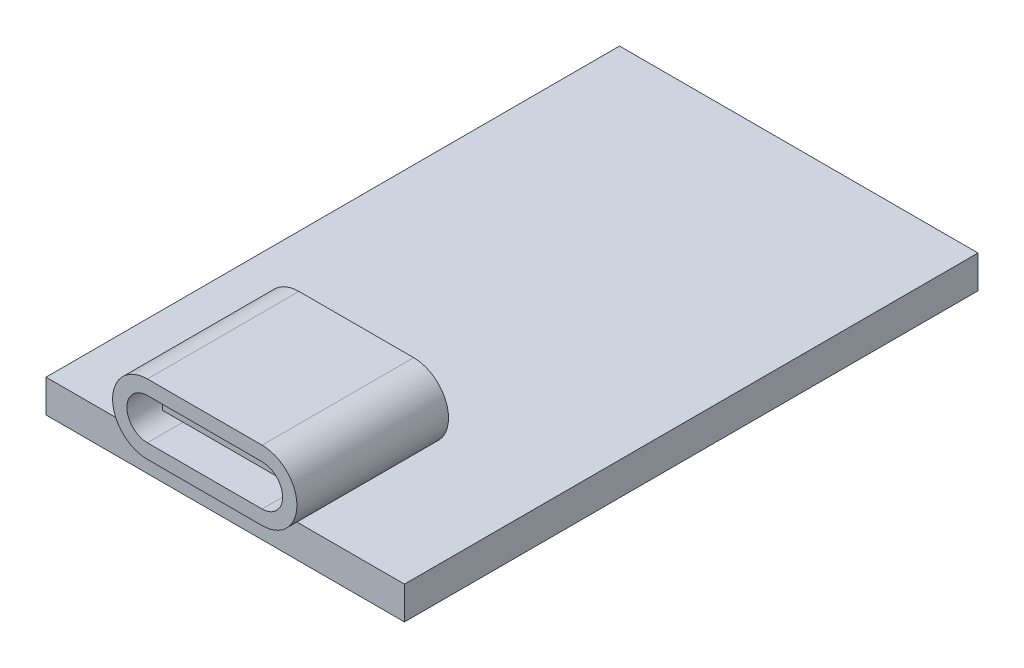
ISO-10303-21;
HEADER;
FILE_DESCRIPTION(('STEP AP214'),'2;1');
FILE_NAME('part.step','',(''),(''),'','','');
FILE_SCHEMA(('AUTOMOTIVE_DESIGN { 1 0 10303 214 1 1 1 1 }'));
ENDSEC;
DATA;
#1=APPLICATION_CONTEXT('core data for automotive mechanical design processes');
#2=APPLICATION_PROTOCOL_DEFINITION('international standard','automotive_design',2000,#1);
#3=PRODUCT_CONTEXT('',#1,'mechanical');
#4=PRODUCT('Part','Part','',(#3));
#5=PRODUCT_RELATED_PRODUCT_CATEGORY('part','',(#4));
#6=PRODUCT_DEFINITION_FORMATION('','',#4);
#7=PRODUCT_DEFINITION_CONTEXT('part definition',#1,'design');
#8=PRODUCT_DEFINITION('design','',#6,#7);
#9=PRODUCT_DEFINITION_SHAPE('','',#8);
#10=(LENGTH_UNIT() NAMED_UNIT(*) SI_UNIT(.MILLI.,.METRE.));
#11=(NAMED_UNIT(*) PLANE_ANGLE_UNIT() SI_UNIT($,.RADIAN.));
#12=(NAMED_UNIT(*) SI_UNIT($,.STERADIAN.) SOLID_ANGLE_UNIT());
#13=UNCERTAINTY_MEASURE_WITH_UNIT(LENGTH_MEASURE(1.E-05),#10,'distance_accuracy_value','');
#14=(GEOMETRIC_REPRESENTATION_CONTEXT(3) GLOBAL_UNCERTAINTY_ASSIGNED_CONTEXT((#13)) GLOBAL_UNIT_ASSIGNED_CONTEXT((#10,
#11,#12)) REPRESENTATION_CONTEXT('',''));
#15=CARTESIAN_POINT('',(0.,0.,0.));
#16=DIRECTION('',(0.,0.,1.));
#17=DIRECTION('',(1.,0.,0.));
#18=AXIS2_PLACEMENT_3D('',#15,#16,#17);
#19=CARTESIAN_POINT('',(11.55,3.3,-5.));
#20=DIRECTION('',(0.,0.,1.));
#21=DIRECTION('',(1.,0.,0.));
#22=AXIS2_PLACEMENT_3D('',#19,#20,#21);
#23=PLANE('',#22);
#24=CARTESIAN_POINT('',(11.55,3.3,-5.));
#25=DIRECTION('',(0.,0.,1.));
#26=DIRECTION('',(1.,0.,0.));
#27=AXIS2_PLACEMENT_3D('',#24,#25,#26);
#28=CIRCLE('',#27,1.);
#29=CARTESIAN_POINT('',(11.55,2.3,-5.));
#30=VERTEX_POINT('',#29);
#31=CARTESIAN_POINT('',(11.55,4.3,-5.));
#32=VERTEX_POINT('',#31);
#33=EDGE_CURVE('E183',#30,#32,#28,.T.);
#34=ORIENTED_EDGE('',*,*,#33,.T.);
#35=DIRECTION('',(-1.,0.,0.));
#36=VECTOR('',#35,1.);
#37=CARTESIAN_POINT('',(11.55,4.3,-5.));
#38=LINE('',#37,#36);
#39=CARTESIAN_POINT('',(5.95,4.3,-5.));
#40=VERTEX_POINT('',#39);
#41=EDGE_CURVE('E186',#32,#40,#38,.T.);
#42=ORIENTED_EDGE('',*,*,#41,.T.);
#43=CARTESIAN_POINT('',(5.95,3.3,-5.));
#44=DIRECTION('',(0.,0.,1.));
#45=DIRECTION('',(1.,0.,0.));
#46=AXIS2_PLACEMENT_3D('',#43,#44,#45);
#47=CIRCLE('',#46,1.);
#48=CARTESIAN_POINT('',(5.95,2.3,-5.));
#49=VERTEX_POINT('',#48);
#50=EDGE_CURVE('E190',#40,#49,#47,.T.);
#51=ORIENTED_EDGE('',*,*,#50,.T.);
#52=DIRECTION('',(1.,0.,0.));
#53=VECTOR('',#52,1.);
#54=CARTESIAN_POINT('',(11.55,2.3,-5.));
#55=LINE('',#54,#53);
#56=EDGE_CURVE('E193',#49,#30,#55,.T.);
#57=ORIENTED_EDGE('',*,*,#56,.T.);
#58=EDGE_LOOP('',(#34,#42,#51,#57));
#59=FACE_BOUND('',#58,.T.);
#60=DIRECTION('',(1.,0.,0.));
#61=VECTOR('',#60,1.);
#62=CARTESIAN_POINT('',(5.69526407856018,3.0413895272943,-5.));
#63=LINE('',#62,#61);
#64=CARTESIAN_POINT('',(5.69526407856018,3.0413895272943,-5.));
#65=VERTEX_POINT('',#64);
#66=CARTESIAN_POINT('',(11.8052805830846,3.0413895272943,-5.));
#67=VERTEX_POINT('',#66);
#68=EDGE_CURVE('E511',#65,#67,#63,.T.);
#69=ORIENTED_EDGE('',*,*,#68,.F.);
#70=DIRECTION('',(0.,-1.,0.));
#71=VECTOR('',#70,1.);
#72=CARTESIAN_POINT('',(5.69526407856018,3.53019084765625,-5.));
#73=LINE('',#72,#71);
#74=CARTESIAN_POINT('',(5.69526407856018,3.53019084765625,-5.));
#75=VERTEX_POINT('',#74);
#76=EDGE_CURVE('E175',#75,#65,#73,.T.);
#77=ORIENTED_EDGE('',*,*,#76,.F.);
#78=DIRECTION('',(-1.,0.,0.));
#79=VECTOR('',#78,1.);
#80=CARTESIAN_POINT('',(5.69526407856018,3.53019084765625,-5.));
#81=LINE('',#80,#79);
#82=CARTESIAN_POINT('',(11.8052805830846,3.53019084765625,-5.));
#83=VERTEX_POINT('',#82);
#84=EDGE_CURVE('E171',#83,#75,#81,.T.);
#85=ORIENTED_EDGE('',*,*,#84,.F.);
#86=DIRECTION('',(0.,1.,0.));
#87=VECTOR('',#86,1.);
#88=CARTESIAN_POINT('',(11.8052805830846,3.53019084765625,-5.));
#89=LINE('',#88,#87);
#90=EDGE_CURVE('E508',#67,#83,#89,.T.);
#91=ORIENTED_EDGE('',*,*,#90,.F.);
#92=EDGE_LOOP('',(#69,#77,#85,#91));
#93=FACE_BOUND('',#92,.T.);
#94=ADVANCED_FACE('F33',(#59,#93),#23,.T.);
#95=CARTESIAN_POINT('',(0.,1.6,0.));
#96=DIRECTION('',(0.,-1.,0.));
#97=DIRECTION('',(0.,0.,-1.));
#98=AXIS2_PLACEMENT_3D('',#95,#96,#97);
#99=PLANE('',#98);
#100=DIRECTION('',(0.,0.,1.));
#101=VECTOR('',#100,1.);
#102=CARTESIAN_POINT('',(5.95,1.6,-6.4));
#103=LINE('',#102,#101);
#104=CARTESIAN_POINT('',(5.95,1.6,-6.4));
#105=VERTEX_POINT('',#104);
#106=CARTESIAN_POINT('',(5.95,1.6,0.));
#107=VERTEX_POINT('',#106);
#108=EDGE_CURVE('E243',#105,#107,#103,.T.);
#109=ORIENTED_EDGE('',*,*,#108,.F.);
#110=DIRECTION('',(1.,0.,0.));
#111=VECTOR('',#110,1.);
#112=CARTESIAN_POINT('',(5.95,1.6,-6.4));
#113=LINE('',#112,#111);
#114=CARTESIAN_POINT('',(11.55,1.6,-6.4));
#115=VERTEX_POINT('',#114);
#116=EDGE_CURVE('E226',#105,#115,#113,.T.);
#117=ORIENTED_EDGE('',*,*,#116,.T.);
#118=DIRECTION('',(0.,0.,1.));
#119=VECTOR('',#118,1.);
#120=CARTESIAN_POINT('',(11.55,1.6,-6.4));
#121=LINE('',#120,#119);
#122=CARTESIAN_POINT('',(11.55,1.6,0.));
#123=VERTEX_POINT('',#122);
#124=EDGE_CURVE('E240',#115,#123,#121,.T.);
#125=ORIENTED_EDGE('',*,*,#124,.T.);
#126=DIRECTION('',(1.,0.,0.));
#127=VECTOR('',#126,1.);
#128=CARTESIAN_POINT('',(0.,1.6,0.));
#129=LINE('',#128,#127);
#130=CARTESIAN_POINT('',(17.5,1.6,0.));
#131=VERTEX_POINT('',#130);
#132=EDGE_CURVE('E249',#123,#131,#129,.T.);
#133=ORIENTED_EDGE('',*,*,#132,.T.);
#134=DIRECTION('',(0.,0.,-1.));
#135=VECTOR('',#134,1.);
#136=CARTESIAN_POINT('',(17.5,1.6,0.));
#137=LINE('',#136,#135);
#138=CARTESIAN_POINT('',(17.5,1.6,-28.));
#139=VERTEX_POINT('',#138);
#140=EDGE_CURVE('E254',#131,#139,#137,.T.);
#141=ORIENTED_EDGE('',*,*,#140,.T.);
#142=DIRECTION('',(-1.,0.,0.));
#143=VECTOR('',#142,1.);
#144=CARTESIAN_POINT('',(0.,1.6,-28.));
#145=LINE('',#144,#143);
#146=CARTESIAN_POINT('',(0.,1.6,-28.));
#147=VERTEX_POINT('',#146);
#148=EDGE_CURVE('E257',#139,#147,#145,.T.);
#149=ORIENTED_EDGE('',*,*,#148,.T.);
#150=DIRECTION('',(0.,0.,1.));
#151=VECTOR('',#150,1.);
#152=CARTESIAN_POINT('',(0.,1.6,0.));
#153=LINE('',#152,#151);
#154=CARTESIAN_POINT('',(0.,1.6,0.));
#155=VERTEX_POINT('',#154);
#156=EDGE_CURVE('E246',#147,#155,#153,.T.);
#157=ORIENTED_EDGE('',*,*,#156,.T.);
#158=EDGE_CURVE('E251',#155,#107,#129,.T.);
#159=ORIENTED_EDGE('',*,*,#158,.T.);
#160=EDGE_LOOP('',(#109,#117,#125,#133,#141,#149,#157,#159));
#161=FACE_BOUND('',#160,.T.);
#162=ADVANCED_FACE('F292',(#161),#99,.F.);
#163=CARTESIAN_POINT('',(0.,1.6,0.));
#164=DIRECTION('',(1.,0.,0.));
#165=DIRECTION('',(0.,0.,-1.));
#166=AXIS2_PLACEMENT_3D('',#163,#164,#165);
#167=PLANE('',#166);
#168=DIRECTION('',(0.,0.,1.));
#169=VECTOR('',#168,1.);
#170=CARTESIAN_POINT('',(0.,0.,0.));
#171=LINE('',#170,#169);
#172=CARTESIAN_POINT('',(0.,0.,-28.));
#173=VERTEX_POINT('',#172);
#174=CARTESIAN_POINT('',(0.,0.,0.));
#175=VERTEX_POINT('',#174);
#176=EDGE_CURVE('E237',#173,#175,#171,.T.);
#177=ORIENTED_EDGE('',*,*,#176,.T.);
#178=DIRECTION('',(0.,-1.,0.));
#179=VECTOR('',#178,1.);
#180=CARTESIAN_POINT('',(0.,1.6,0.));
#181=LINE('',#180,#179);
#182=EDGE_CURVE('E11',#155,#175,#181,.T.);
#183=ORIENTED_EDGE('',*,*,#182,.F.);
#184=ORIENTED_EDGE('',*,*,#156,.F.);
#185=DIRECTION('',(0.,-1.,0.));
#186=VECTOR('',#185,1.);
#187=CARTESIAN_POINT('',(0.,1.6,-28.));
#188=LINE('',#187,#186);
#189=EDGE_CURVE('E259',#147,#173,#188,.T.);
#190=ORIENTED_EDGE('',*,*,#189,.T.);
#191=EDGE_LOOP('',(#177,#183,#184,#190));
#192=FACE_BOUND('',#191,.T.);
#193=ADVANCED_FACE('F35',(#192),#167,.F.);
#194=CARTESIAN_POINT('',(0.,1.6,0.));
#195=DIRECTION('',(0.,0.,-1.));
#196=DIRECTION('',(-1.,0.,0.));
#197=AXIS2_PLACEMENT_3D('',#194,#195,#196);
#198=PLANE('',#197);
#199=DIRECTION('',(1.,0.,0.));
#200=VECTOR('',#199,1.);
#201=CARTESIAN_POINT('',(0.,0.,0.));
#202=LINE('',#201,#200);
#203=CARTESIAN_POINT('',(17.5,0.,0.));
#204=VERTEX_POINT('',#203);
#205=EDGE_CURVE('E262',#175,#204,#202,.T.);
#206=ORIENTED_EDGE('',*,*,#205,.T.);
#207=DIRECTION('',(0.,-1.,0.));
#208=VECTOR('',#207,1.);
#209=CARTESIAN_POINT('',(17.5,1.6,0.));
#210=LINE('',#209,#208);
#211=EDGE_CURVE('E41',#131,#204,#210,.T.);
#212=ORIENTED_EDGE('',*,*,#211,.F.);
#213=ORIENTED_EDGE('',*,*,#132,.F.);
#214=EDGE_CURVE('E255',#107,#123,#129,.T.);
#215=ORIENTED_EDGE('',*,*,#214,.F.);
#216=ORIENTED_EDGE('',*,*,#158,.F.);
#217=ORIENTED_EDGE('',*,*,#182,.T.);
#218=EDGE_LOOP('',(#206,#212,#213,#215,#216,#217));
#219=FACE_BOUND('',#218,.T.);
#220=ADVANCED_FACE('F482',(#219),#198,.F.);
#221=CARTESIAN_POINT('',(17.5,1.6,0.));
#222=DIRECTION('',(-1.,0.,0.));
#223=DIRECTION('',(0.,0.,1.));
#224=AXIS2_PLACEMENT_3D('',#221,#222,#223);
#225=PLANE('',#224);
#226=DIRECTION('',(0.,0.,-1.));
#227=VECTOR('',#226,1.);
#228=CARTESIAN_POINT('',(17.5,0.,0.));
#229=LINE('',#228,#227);
#230=CARTESIAN_POINT('',(17.5,0.,-28.));
#231=VERTEX_POINT('',#230);
#232=EDGE_CURVE('E264',#204,#231,#229,.T.);
#233=ORIENTED_EDGE('',*,*,#232,.T.);
#234=DIRECTION('',(0.,-1.,0.));
#235=VECTOR('',#234,1.);
#236=CARTESIAN_POINT('',(17.5,1.6,-28.));
#237=LINE('',#236,#235);
#238=EDGE_CURVE('E269',#139,#231,#237,.T.);
#239=ORIENTED_EDGE('',*,*,#238,.F.);
#240=ORIENTED_EDGE('',*,*,#140,.F.);
#241=ORIENTED_EDGE('',*,*,#211,.T.);
#242=EDGE_LOOP('',(#233,#239,#240,#241));
#243=FACE_BOUND('',#242,.T.);
#244=ADVANCED_FACE('F276',(#243),#225,.F.);
#245=CARTESIAN_POINT('',(0.,1.6,-28.));
#246=DIRECTION('',(0.,0.,1.));
#247=DIRECTION('',(1.,0.,0.));
#248=AXIS2_PLACEMENT_3D('',#245,#246,#247);
#249=PLANE('',#248);
#250=DIRECTION('',(-1.,0.,0.));
#251=VECTOR('',#250,1.);
#252=CARTESIAN_POINT('',(0.,0.,-28.));
#253=LINE('',#252,#251);
#254=EDGE_CURVE('E250',#231,#173,#253,.T.);
#255=ORIENTED_EDGE('',*,*,#254,.T.);
#256=ORIENTED_EDGE('',*,*,#189,.F.);
#257=ORIENTED_EDGE('',*,*,#148,.F.);
#258=ORIENTED_EDGE('',*,*,#238,.T.);
#259=EDGE_LOOP('',(#255,#256,#257,#258));
#260=FACE_BOUND('',#259,.T.);
#261=ADVANCED_FACE('F286',(#260),#249,.F.);
#262=CARTESIAN_POINT('',(0.,0.,0.));
#263=DIRECTION('',(0.,-1.,0.));
#264=DIRECTION('',(0.,0.,-1.));
#265=AXIS2_PLACEMENT_3D('',#262,#263,#264);
#266=PLANE('',#265);
#267=ORIENTED_EDGE('',*,*,#176,.F.);
#268=ORIENTED_EDGE('',*,*,#254,.F.);
#269=ORIENTED_EDGE('',*,*,#232,.F.);
#270=ORIENTED_EDGE('',*,*,#205,.F.);
#271=EDGE_LOOP('',(#267,#268,#269,#270));
#272=FACE_BOUND('',#271,.T.);
#273=ADVANCED_FACE('F283',(#272),#266,.T.);
#274=CARTESIAN_POINT('',(5.95,1.6,-6.4));
#275=DIRECTION('',(0.,-1.,0.));
#276=DIRECTION('',(1.,0.,0.));
#277=AXIS2_PLACEMENT_3D('',#274,#275,#276);
#278=PLANE('',#277);
#279=ORIENTED_EDGE('',*,*,#214,.T.);
#280=CARTESIAN_POINT('',(11.55,1.6,1.));
#281=VERTEX_POINT('',#280);
#282=EDGE_CURVE('E242',#123,#281,#121,.T.);
#283=ORIENTED_EDGE('',*,*,#282,.T.);
#284=DIRECTION('',(1.,0.,0.));
#285=VECTOR('',#284,1.);
#286=CARTESIAN_POINT('',(5.95,1.6,1.));
#287=LINE('',#286,#285);
#288=CARTESIAN_POINT('',(5.95,1.6,1.));
#289=VERTEX_POINT('',#288);
#290=EDGE_CURVE('E214',#289,#281,#287,.T.);
#291=ORIENTED_EDGE('',*,*,#290,.F.);
#292=EDGE_CURVE('E234',#107,#289,#103,.T.);
#293=ORIENTED_EDGE('',*,*,#292,.F.);
#294=EDGE_LOOP('',(#279,#283,#291,#293));
#295=FACE_BOUND('',#294,.T.);
#296=ADVANCED_FACE('F298',(#295),#278,.T.);
#297=CARTESIAN_POINT('',(5.95,3.3,-6.4));
#298=DIRECTION('',(0.,0.,1.));
#299=DIRECTION('',(1.,0.,0.));
#300=AXIS2_PLACEMENT_3D('',#297,#298,#299);
#301=CYLINDRICAL_SURFACE('',#300,1.7);
#302=ORIENTED_EDGE('',*,*,#108,.T.);
#303=ORIENTED_EDGE('',*,*,#292,.T.);
#304=CARTESIAN_POINT('',(5.95,3.3,1.));
#305=DIRECTION('',(0.,0.,1.));
#306=DIRECTION('',(1.,0.,0.));
#307=AXIS2_PLACEMENT_3D('',#304,#305,#306);
#308=CIRCLE('',#307,1.7);
#309=CARTESIAN_POINT('',(5.95,5.,1.));
#310=VERTEX_POINT('',#309);
#311=EDGE_CURVE('E206',#310,#289,#308,.T.);
#312=ORIENTED_EDGE('',*,*,#311,.F.);
#313=DIRECTION('',(0.,0.,1.));
#314=VECTOR('',#313,1.);
#315=CARTESIAN_POINT('',(5.95,5.,-6.4));
#316=LINE('',#315,#314);
#317=CARTESIAN_POINT('',(5.95,5.,-6.4));
#318=VERTEX_POINT('',#317);
#319=EDGE_CURVE('E235',#318,#310,#316,.T.);
#320=ORIENTED_EDGE('',*,*,#319,.F.);
#321=CARTESIAN_POINT('',(5.95,3.3,-6.4));
#322=DIRECTION('',(0.,0.,1.));
#323=DIRECTION('',(1.,0.,0.));
#324=AXIS2_PLACEMENT_3D('',#321,#322,#323);
#325=CIRCLE('',#324,1.7);
#326=EDGE_CURVE('E223',#318,#105,#325,.T.);
#327=ORIENTED_EDGE('',*,*,#326,.T.);
#328=EDGE_LOOP('',(#302,#303,#312,#320,#327));
#329=FACE_BOUND('',#328,.T.);
#330=ADVANCED_FACE('F313',(#329),#301,.T.);
#331=CARTESIAN_POINT('',(5.95,5.,-6.4));
#332=DIRECTION('',(0.,1.,0.));
#333=DIRECTION('',(-1.,0.,0.));
#334=AXIS2_PLACEMENT_3D('',#331,#332,#333);
#335=PLANE('',#334);
#336=ORIENTED_EDGE('',*,*,#319,.T.);
#337=DIRECTION('',(-1.,0.,0.));
#338=VECTOR('',#337,1.);
#339=CARTESIAN_POINT('',(5.95,5.,1.));
#340=LINE('',#339,#338);
#341=CARTESIAN_POINT('',(11.55,5.,1.));
#342=VERTEX_POINT('',#341);
#343=EDGE_CURVE('E220',#342,#310,#340,.T.);
#344=ORIENTED_EDGE('',*,*,#343,.F.);
#345=DIRECTION('',(0.,0.,1.));
#346=VECTOR('',#345,1.);
#347=CARTESIAN_POINT('',(11.55,5.,-6.4));
#348=LINE('',#347,#346);
#349=CARTESIAN_POINT('',(11.55,5.,-6.4));
#350=VERTEX_POINT('',#349);
#351=EDGE_CURVE('E238',#350,#342,#348,.T.);
#352=ORIENTED_EDGE('',*,*,#351,.F.);
#353=DIRECTION('',(-1.,0.,0.));
#354=VECTOR('',#353,1.);
#355=CARTESIAN_POINT('',(5.95,5.,-6.4));
#356=LINE('',#355,#354);
#357=EDGE_CURVE('E231',#350,#318,#356,.T.);
#358=ORIENTED_EDGE('',*,*,#357,.T.);
#359=EDGE_LOOP('',(#336,#344,#352,#358));
#360=FACE_BOUND('',#359,.T.);
#361=ADVANCED_FACE('F309',(#360),#335,.T.);
#362=CARTESIAN_POINT('',(11.55,3.3,-6.4));
#363=DIRECTION('',(0.,0.,1.));
#364=DIRECTION('',(1.,0.,0.));
#365=AXIS2_PLACEMENT_3D('',#362,#363,#364);
#366=CYLINDRICAL_SURFACE('',#365,1.7);
#367=ORIENTED_EDGE('',*,*,#351,.T.);
#368=CARTESIAN_POINT('',(11.55,3.3,1.));
#369=DIRECTION('',(0.,0.,1.));
#370=DIRECTION('',(1.,0.,0.));
#371=AXIS2_PLACEMENT_3D('',#368,#369,#370);
#372=CIRCLE('',#371,1.7);
#373=EDGE_CURVE('E217',#281,#342,#372,.T.);
#374=ORIENTED_EDGE('',*,*,#373,.F.);
#375=ORIENTED_EDGE('',*,*,#282,.F.);
#376=ORIENTED_EDGE('',*,*,#124,.F.);
#377=CARTESIAN_POINT('',(11.55,3.3,-6.4));
#378=DIRECTION('',(0.,0.,1.));
#379=DIRECTION('',(1.,0.,0.));
#380=AXIS2_PLACEMENT_3D('',#377,#378,#379);
#381=CIRCLE('',#380,1.7);
#382=EDGE_CURVE('E228',#115,#350,#381,.T.);
#383=ORIENTED_EDGE('',*,*,#382,.T.);
#384=EDGE_LOOP('',(#367,#374,#375,#376,#383));
#385=FACE_BOUND('',#384,.T.);
#386=ADVANCED_FACE('F302',(#385),#366,.T.);
#387=CARTESIAN_POINT('',(5.95,3.3,-6.4));
#388=DIRECTION('',(0.,0.,1.));
#389=DIRECTION('',(1.,0.,0.));
#390=AXIS2_PLACEMENT_3D('',#387,#388,#389);
#391=PLANE('',#390);
#392=ORIENTED_EDGE('',*,*,#326,.F.);
#393=ORIENTED_EDGE('',*,*,#357,.F.);
#394=ORIENTED_EDGE('',*,*,#382,.F.);
#395=ORIENTED_EDGE('',*,*,#116,.F.);
#396=EDGE_LOOP('',(#392,#393,#394,#395));
#397=FACE_BOUND('',#396,.T.);
#398=ADVANCED_FACE('F316',(#397),#391,.F.);
#399=CARTESIAN_POINT('',(5.95,3.3,1.));
#400=DIRECTION('',(0.,0.,1.));
#401=DIRECTION('',(1.,0.,0.));
#402=AXIS2_PLACEMENT_3D('',#399,#400,#401);
#403=PLANE('',#402);
#404=CARTESIAN_POINT('',(11.55,3.3,1.));
#405=DIRECTION('',(0.,0.,1.));
#406=DIRECTION('',(1.,0.,0.));
#407=AXIS2_PLACEMENT_3D('',#404,#405,#406);
#408=CIRCLE('',#407,1.);
#409=CARTESIAN_POINT('',(11.55,2.3,1.));
#410=VERTEX_POINT('',#409);
#411=CARTESIAN_POINT('',(11.55,4.3,1.));
#412=VERTEX_POINT('',#411);
#413=EDGE_CURVE('E56',#410,#412,#408,.T.);
#414=ORIENTED_EDGE('',*,*,#413,.F.);
#415=DIRECTION('',(1.,0.,0.));
#416=VECTOR('',#415,1.);
#417=CARTESIAN_POINT('',(11.55,2.3,1.));
#418=LINE('',#417,#416);
#419=CARTESIAN_POINT('',(5.95,2.3,1.));
#420=VERTEX_POINT('',#419);
#421=EDGE_CURVE('E187',#420,#410,#418,.T.);
#422=ORIENTED_EDGE('',*,*,#421,.F.);
#423=CARTESIAN_POINT('',(5.95,3.3,1.));
#424=DIRECTION('',(0.,0.,1.));
#425=DIRECTION('',(1.,0.,0.));
#426=AXIS2_PLACEMENT_3D('',#423,#424,#425);
#427=CIRCLE('',#426,1.);
#428=CARTESIAN_POINT('',(5.95,4.3,1.));
#429=VERTEX_POINT('',#428);
#430=EDGE_CURVE('E199',#429,#420,#427,.T.);
#431=ORIENTED_EDGE('',*,*,#430,.F.);
#432=DIRECTION('',(-1.,0.,0.));
#433=VECTOR('',#432,1.);
#434=CARTESIAN_POINT('',(11.55,4.3,1.));
#435=LINE('',#434,#433);
#436=EDGE_CURVE('E178',#412,#429,#435,.T.);
#437=ORIENTED_EDGE('',*,*,#436,.F.);
#438=EDGE_LOOP('',(#414,#422,#431,#437));
#439=FACE_BOUND('',#438,.T.);
#440=ORIENTED_EDGE('',*,*,#311,.T.);
#441=ORIENTED_EDGE('',*,*,#290,.T.);
#442=ORIENTED_EDGE('',*,*,#373,.T.);
#443=ORIENTED_EDGE('',*,*,#343,.T.);
#444=EDGE_LOOP('',(#440,#441,#442,#443));
#445=FACE_BOUND('',#444,.T.);
#446=ADVANCED_FACE('F306',(#439,#445),#403,.T.);
#447=CARTESIAN_POINT('',(11.55,3.3,-5.));
#448=DIRECTION('',(0.,0.,1.));
#449=DIRECTION('',(1.,0.,0.));
#450=AXIS2_PLACEMENT_3D('',#447,#448,#449);
#451=CYLINDRICAL_SURFACE('',#450,1.);
#452=ORIENTED_EDGE('',*,*,#413,.T.);
#453=DIRECTION('',(0.,0.,1.));
#454=VECTOR('',#453,1.);
#455=CARTESIAN_POINT('',(11.55,4.3,-5.));
#456=LINE('',#455,#454);
#457=EDGE_CURVE('E195',#32,#412,#456,.T.);
#458=ORIENTED_EDGE('',*,*,#457,.F.);
#459=ORIENTED_EDGE('',*,*,#33,.F.);
#460=DIRECTION('',(0.,0.,1.));
#461=VECTOR('',#460,1.);
#462=CARTESIAN_POINT('',(11.55,2.3,-5.));
#463=LINE('',#462,#461);
#464=EDGE_CURVE('E204',#30,#410,#463,.T.);
#465=ORIENTED_EDGE('',*,*,#464,.T.);
#466=EDGE_LOOP('',(#452,#458,#459,#465));
#467=FACE_BOUND('',#466,.T.);
#468=ADVANCED_FACE('F323',(#467),#451,.F.);
#469=CARTESIAN_POINT('',(11.55,2.3,-5.));
#470=DIRECTION('',(0.,-1.,0.));
#471=DIRECTION('',(1.,0.,0.));
#472=AXIS2_PLACEMENT_3D('',#469,#470,#471);
#473=PLANE('',#472);
#474=ORIENTED_EDGE('',*,*,#421,.T.);
#475=ORIENTED_EDGE('',*,*,#464,.F.);
#476=ORIENTED_EDGE('',*,*,#56,.F.);
#477=DIRECTION('',(0.,0.,1.));
#478=VECTOR('',#477,1.);
#479=CARTESIAN_POINT('',(5.95,2.3,-5.));
#480=LINE('',#479,#478);
#481=EDGE_CURVE('E207',#49,#420,#480,.T.);
#482=ORIENTED_EDGE('',*,*,#481,.T.);
#483=EDGE_LOOP('',(#474,#475,#476,#482));
#484=FACE_BOUND('',#483,.T.);
#485=ADVANCED_FACE('F339',(#484),#473,.F.);
#486=CARTESIAN_POINT('',(5.95,3.3,-5.));
#487=DIRECTION('',(0.,0.,1.));
#488=DIRECTION('',(1.,0.,0.));
#489=AXIS2_PLACEMENT_3D('',#486,#487,#488);
#490=CYLINDRICAL_SURFACE('',#489,1.);
#491=ORIENTED_EDGE('',*,*,#430,.T.);
#492=ORIENTED_EDGE('',*,*,#481,.F.);
#493=ORIENTED_EDGE('',*,*,#50,.F.);
#494=DIRECTION('',(0.,0.,1.));
#495=VECTOR('',#494,1.);
#496=CARTESIAN_POINT('',(5.95,4.3,-5.));
#497=LINE('',#496,#495);
#498=EDGE_CURVE('E209',#40,#429,#497,.T.);
#499=ORIENTED_EDGE('',*,*,#498,.T.);
#500=EDGE_LOOP('',(#491,#492,#493,#499));
#501=FACE_BOUND('',#500,.T.);
#502=ADVANCED_FACE('F342',(#501),#490,.F.);
#503=CARTESIAN_POINT('',(11.55,4.3,-5.));
#504=DIRECTION('',(0.,1.,0.));
#505=DIRECTION('',(-1.,0.,0.));
#506=AXIS2_PLACEMENT_3D('',#503,#504,#505);
#507=PLANE('',#506);
#508=ORIENTED_EDGE('',*,*,#436,.T.);
#509=ORIENTED_EDGE('',*,*,#498,.F.);
#510=ORIENTED_EDGE('',*,*,#41,.F.);
#511=ORIENTED_EDGE('',*,*,#457,.T.);
#512=EDGE_LOOP('',(#508,#509,#510,#511));
#513=FACE_BOUND('',#512,.T.);
#514=ADVANCED_FACE('F346',(#513),#507,.F.);
#515=CARTESIAN_POINT('',(5.69526407856018,3.53019084765625,0.));
#516=DIRECTION('',(1.,0.,0.));
#517=DIRECTION('',(0.,0.,-1.));
#518=AXIS2_PLACEMENT_3D('',#515,#516,#517);
#519=PLANE('',#518);
#520=ORIENTED_EDGE('',*,*,#76,.T.);
#521=DIRECTION('',(0.,0.,-1.));
#522=VECTOR('',#521,1.);
#523=CARTESIAN_POINT('',(5.69526407856018,3.0413895272943,0.));
#524=LINE('',#523,#522);
#525=CARTESIAN_POINT('',(5.69526407856018,3.0413895272943,0.));
#526=VERTEX_POINT('',#525);
#527=EDGE_CURVE('E156',#526,#65,#524,.T.);
#528=ORIENTED_EDGE('',*,*,#527,.F.);
#529=DIRECTION('',(0.,-1.,0.));
#530=VECTOR('',#529,1.);
#531=CARTESIAN_POINT('',(5.69526407856018,3.53019084765625,0.));
#532=LINE('',#531,#530);
#533=CARTESIAN_POINT('',(5.69526407856018,3.53019084765625,0.));
#534=VERTEX_POINT('',#533);
#535=EDGE_CURVE('E163',#534,#526,#532,.T.);
#536=ORIENTED_EDGE('',*,*,#535,.F.);
#537=DIRECTION('',(0.,0.,-1.));
#538=VECTOR('',#537,1.);
#539=CARTESIAN_POINT('',(5.69526407856018,3.53019084765625,0.));
#540=LINE('',#539,#538);
#541=EDGE_CURVE('E506',#534,#75,#540,.T.);
#542=ORIENTED_EDGE('',*,*,#541,.T.);
#543=EDGE_LOOP('',(#520,#528,#536,#542));
#544=FACE_BOUND('',#543,.T.);
#545=ADVANCED_FACE('F173',(#544),#519,.F.);
#546=CARTESIAN_POINT('',(5.69526407856018,3.0413895272943,0.));
#547=DIRECTION('',(0.,1.,0.));
#548=DIRECTION('',(0.,0.,1.));
#549=AXIS2_PLACEMENT_3D('',#546,#547,#548);
#550=PLANE('',#549);
#551=ORIENTED_EDGE('',*,*,#68,.T.);
#552=DIRECTION('',(0.,0.,-1.));
#553=VECTOR('',#552,1.);
#554=CARTESIAN_POINT('',(11.8052805830846,3.0413895272943,0.));
#555=LINE('',#554,#553);
#556=CARTESIAN_POINT('',(11.8052805830846,3.0413895272943,0.));
#557=VERTEX_POINT('',#556);
#558=EDGE_CURVE('E159',#557,#67,#555,.T.);
#559=ORIENTED_EDGE('',*,*,#558,.F.);
#560=DIRECTION('',(1.,0.,0.));
#561=VECTOR('',#560,1.);
#562=CARTESIAN_POINT('',(5.69526407856018,3.0413895272943,0.));
#563=LINE('',#562,#561);
#564=EDGE_CURVE('E152',#526,#557,#563,.T.);
#565=ORIENTED_EDGE('',*,*,#564,.F.);
#566=ORIENTED_EDGE('',*,*,#527,.T.);
#567=EDGE_LOOP('',(#551,#559,#565,#566));
#568=FACE_BOUND('',#567,.T.);
#569=ADVANCED_FACE('F154',(#568),#550,.F.);
#570=CARTESIAN_POINT('',(11.8052805830846,3.53019084765625,0.));
#571=DIRECTION('',(-1.,0.,0.));
#572=DIRECTION('',(0.,0.,1.));
#573=AXIS2_PLACEMENT_3D('',#570,#571,#572);
#574=PLANE('',#573);
#575=ORIENTED_EDGE('',*,*,#90,.T.);
#576=DIRECTION('',(0.,0.,-1.));
#577=VECTOR('',#576,1.);
#578=CARTESIAN_POINT('',(11.8052805830846,3.53019084765625,0.));
#579=LINE('',#578,#577);
#580=CARTESIAN_POINT('',(11.8052805830846,3.53019084765625,0.));
#581=VERTEX_POINT('',#580);
#582=EDGE_CURVE('E48',#581,#83,#579,.T.);
#583=ORIENTED_EDGE('',*,*,#582,.F.);
#584=DIRECTION('',(0.,1.,0.));
#585=VECTOR('',#584,1.);
#586=CARTESIAN_POINT('',(11.8052805830846,3.53019084765625,0.));
#587=LINE('',#586,#585);
#588=EDGE_CURVE('E162',#557,#581,#587,.T.);
#589=ORIENTED_EDGE('',*,*,#588,.F.);
#590=ORIENTED_EDGE('',*,*,#558,.T.);
#591=EDGE_LOOP('',(#575,#583,#589,#590));
#592=FACE_BOUND('',#591,.T.);
#593=ADVANCED_FACE('F379',(#592),#574,.F.);
#594=CARTESIAN_POINT('',(5.69526407856018,3.53019084765625,0.));
#595=DIRECTION('',(0.,-1.,0.));
#596=DIRECTION('',(0.,0.,-1.));
#597=AXIS2_PLACEMENT_3D('',#594,#595,#596);
#598=PLANE('',#597);
#599=ORIENTED_EDGE('',*,*,#84,.T.);
#600=ORIENTED_EDGE('',*,*,#541,.F.);
#601=DIRECTION('',(-1.,0.,0.));
#602=VECTOR('',#601,1.);
#603=CARTESIAN_POINT('',(5.69526407856018,3.53019084765625,0.));
#604=LINE('',#603,#602);
#605=EDGE_CURVE('E167',#581,#534,#604,.T.);
#606=ORIENTED_EDGE('',*,*,#605,.F.);
#607=ORIENTED_EDGE('',*,*,#582,.T.);
#608=EDGE_LOOP('',(#599,#600,#606,#607));
#609=FACE_BOUND('',#608,.T.);
#610=ADVANCED_FACE('F385',(#609),#598,.F.);
#611=CARTESIAN_POINT('',(0.,0.,0.));
#612=DIRECTION('',(0.,0.,1.));
#613=DIRECTION('',(1.,0.,0.));
#614=AXIS2_PLACEMENT_3D('',#611,#612,#613);
#615=PLANE('',#614);
#616=ORIENTED_EDGE('',*,*,#535,.T.);
#617=ORIENTED_EDGE('',*,*,#564,.T.);
#618=ORIENTED_EDGE('',*,*,#588,.T.);
#619=ORIENTED_EDGE('',*,*,#605,.T.);
#620=EDGE_LOOP('',(#616,#617,#618,#619));
#621=FACE_BOUND('',#620,.T.);
#622=ADVANCED_FACE('F166',(#621),#615,.T.);
#623=CLOSED_SHELL('',(#94,#162,#193,#220,#244,#261,#273,#296,#330,#361,#386,#398,#446,#468,#485,
#502,#514,#545,#569,#593,#610,#622));
#624=MANIFOLD_SOLID_BREP('B2',#623);
#625=ADVANCED_BREP_SHAPE_REPRESENTATION('',(#18,#624),#14);
#626=SHAPE_DEFINITION_REPRESENTATION(#9,#625);
ENDSEC;
END-ISO-10303-21;
